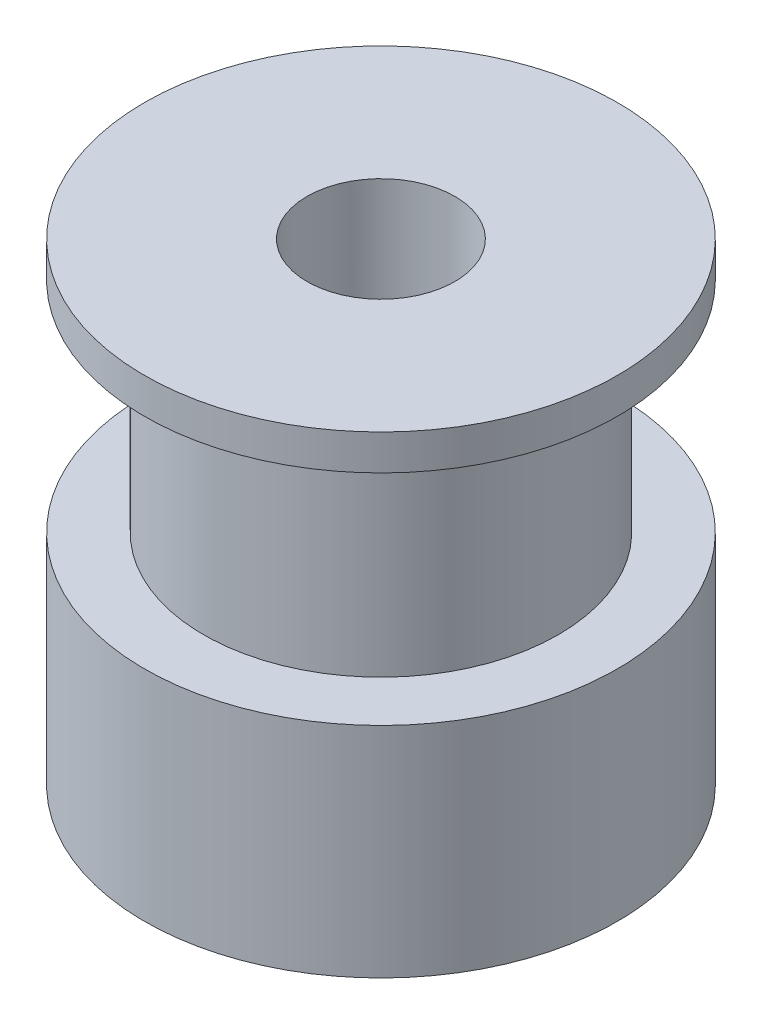
ISO-10303-21;
HEADER;
FILE_DESCRIPTION(('STEP AP214'),'2;1');
FILE_NAME('part.step','',(''),(''),'','','');
FILE_SCHEMA(('AUTOMOTIVE_DESIGN { 1 0 10303 214 1 1 1 1 }'));
ENDSEC;
DATA;
#1=APPLICATION_CONTEXT('core data for automotive mechanical design processes');
#2=APPLICATION_PROTOCOL_DEFINITION('international standard','automotive_design',2000,#1);
#3=PRODUCT_CONTEXT('',#1,'mechanical');
#4=PRODUCT('Part','Part','',(#3));
#5=PRODUCT_RELATED_PRODUCT_CATEGORY('part','',(#4));
#6=PRODUCT_DEFINITION_FORMATION('','',#4);
#7=PRODUCT_DEFINITION_CONTEXT('part definition',#1,'design');
#8=PRODUCT_DEFINITION('design','',#6,#7);
#9=PRODUCT_DEFINITION_SHAPE('','',#8);
#10=(LENGTH_UNIT() NAMED_UNIT(*) SI_UNIT(.MILLI.,.METRE.));
#11=(NAMED_UNIT(*) PLANE_ANGLE_UNIT() SI_UNIT($,.RADIAN.));
#12=(NAMED_UNIT(*) SI_UNIT($,.STERADIAN.) SOLID_ANGLE_UNIT());
#13=UNCERTAINTY_MEASURE_WITH_UNIT(LENGTH_MEASURE(1.E-05),#10,'distance_accuracy_value','');
#14=(GEOMETRIC_REPRESENTATION_CONTEXT(3) GLOBAL_UNCERTAINTY_ASSIGNED_CONTEXT((#13)) GLOBAL_UNIT_ASSIGNED_CONTEXT((#10,
#11,#12)) REPRESENTATION_CONTEXT('',''));
#15=CARTESIAN_POINT('',(0.,0.,0.));
#16=DIRECTION('',(0.,0.,1.));
#17=DIRECTION('',(1.,0.,0.));
#18=AXIS2_PLACEMENT_3D('',#15,#16,#17);
#19=CARTESIAN_POINT('',(0.,-11.,0.));
#20=DIRECTION('',(0.,-1.,0.));
#21=DIRECTION('',(1.,0.,0.));
#22=AXIS2_PLACEMENT_3D('',#19,#20,#21);
#23=PLANE('',#22);
#24=CARTESIAN_POINT('',(0.,-11.,0.));
#25=DIRECTION('',(0.,-1.,0.));
#26=DIRECTION('',(1.,0.,0.));
#27=AXIS2_PLACEMENT_3D('',#24,#25,#26);
#28=CIRCLE('',#27,2.5);
#29=CARTESIAN_POINT('',(2.5,-11.,0.));
#30=VERTEX_POINT('',#29);
#31=EDGE_CURVE('E72',#30,#30,#28,.F.);
#32=ORIENTED_EDGE('',*,*,#31,.T.);
#33=EDGE_LOOP('',(#32));
#34=FACE_BOUND('',#33,.T.);
#35=CARTESIAN_POINT('',(0.,-10.9999999999999,0.));
#36=DIRECTION('',(0.,1.,0.));
#37=DIRECTION('',(-1.,0.,0.));
#38=AXIS2_PLACEMENT_3D('',#35,#36,#37);
#39=CIRCLE('',#38,8.);
#40=CARTESIAN_POINT('',(-8.,-10.9999999999999,0.));
#41=VERTEX_POINT('',#40);
#42=EDGE_CURVE('E11',#41,#41,#39,.T.);
#43=ORIENTED_EDGE('',*,*,#42,.F.);
#44=EDGE_LOOP('',(#43));
#45=FACE_BOUND('',#44,.T.);
#46=ADVANCED_FACE('F39',(#34,#45),#23,.T.);
#47=CARTESIAN_POINT('',(0.,1004.77636363636,0.));
#48=DIRECTION('',(0.,1.,0.));
#49=DIRECTION('',(-1.,0.,0.));
#50=AXIS2_PLACEMENT_3D('',#47,#48,#49);
#51=CYLINDRICAL_SURFACE('',#50,8.);
#52=CARTESIAN_POINT('',(-7.74596669241484,-7.30000000000005,-1.99999999999997));
#53=CARTESIAN_POINT('',(-7.74596880070288,-7.18955939925879,-1.99999686287443));
#54=CARTESIAN_POINT('',(-7.74835444811678,-7.07908408105723,-1.99082099639809));
#55=CARTESIAN_POINT('',(-7.75761489594052,-6.86130593746124,-1.95441850037101));
#56=CARTESIAN_POINT('',(-7.76449230897305,-6.7540049964255,-1.92718136539366));
#57=CARTESIAN_POINT('',(-7.78190979676921,-6.5457571694503,-1.85559295970561));
#58=CARTESIAN_POINT('',(-7.79244514152367,-6.44480227569148,-1.81126378228357));
#59=CARTESIAN_POINT('',(-7.81598553623007,-6.25175131796814,-1.70681691300908));
#60=CARTESIAN_POINT('',(-7.82899069102792,-6.15965563033588,-1.64669855084852));
#61=CARTESIAN_POINT('',(-7.856325730845,-5.98491068379028,-1.51096674184948));
#62=CARTESIAN_POINT('',(-7.87067678098427,-5.90248511972001,-1.43506951016321));
#63=CARTESIAN_POINT('',(-7.89890300412235,-5.75139088451178,-1.2705456512805));
#64=CARTESIAN_POINT('',(-7.91277813253111,-5.68272349950265,-1.18191783534422));
#65=CARTESIAN_POINT('',(-7.93872332416466,-5.56017962589503,-0.992916160863138));
#66=CARTESIAN_POINT('',(-7.95076549920474,-5.50652288947088,-0.89239566095607));
#67=CARTESIAN_POINT('',(-7.97144649540787,-5.41695228467758,-0.683410547434183));
#68=CARTESIAN_POINT('',(-7.98008581867475,-5.38103579846764,-0.574947108633526));
#69=CARTESIAN_POINT('',(-7.99283807078544,-5.32868173233718,-0.355487007003302));
#70=CARTESIAN_POINT('',(-7.99703915075451,-5.31186428453878,-0.244586175639154));
#71=CARTESIAN_POINT('',(-8.00074875285838,-5.2969932965796,-0.0214630554101889));
#72=CARTESIAN_POINT('',(-8.00025796877363,-5.29893698223237,0.0907590356304813));
#73=CARTESIAN_POINT('',(-7.99470475962827,-5.32125988020016,0.310704494344801));
#74=CARTESIAN_POINT('',(-7.98974401872699,-5.34122906004313,0.41847243120216));
#75=CARTESIAN_POINT('',(-7.97592669219883,-5.39837701603885,0.629076494827399));
#76=CARTESIAN_POINT('',(-7.96706989918752,-5.43555670830197,0.731912358740902));
#77=CARTESIAN_POINT('',(-7.94630007760716,-5.5264020565497,0.930813407003639));
#78=CARTESIAN_POINT('',(-7.93436015756042,-5.58021363572944,1.02680901953303));
#79=CARTESIAN_POINT('',(-7.90871923047719,-5.70268454329305,1.208551244681));
#80=CARTESIAN_POINT('',(-7.89501791721991,-5.77134645484854,1.29429607017104));
#81=CARTESIAN_POINT('',(-7.86690971015616,-5.92376699358595,1.45554807016994));
#82=CARTESIAN_POINT('',(-7.85249375620733,-6.00788391387827,1.53071535815042));
#83=CARTESIAN_POINT('',(-7.82492034813364,-6.18767997883225,1.66595275192606));
#84=CARTESIAN_POINT('',(-7.81176295284776,-6.28335966359285,1.72602215209206));
#85=CARTESIAN_POINT('',(-7.78816397465318,-6.48423202731922,1.82957625804522));
#86=CARTESIAN_POINT('',(-7.77773586980576,-6.5894685842506,1.87297913394101));
#87=CARTESIAN_POINT('',(-7.76094912111965,-6.80606837446121,1.94137124127271));
#88=CARTESIAN_POINT('',(-7.75458960648174,-6.91743029118656,1.96636441310585));
#89=CARTESIAN_POINT('',(-7.74684284831312,-7.13996760121854,1.99666371093217));
#90=CARTESIAN_POINT('',(-7.74532871274918,-7.25107023466375,2.00247237913573));
#91=CARTESIAN_POINT('',(-7.74709874784831,-7.47265754926257,1.99561359241246));
#92=CARTESIAN_POINT('',(-7.75038247681012,-7.58314228636104,1.98294783827907));
#93=CARTESIAN_POINT('',(-7.76125665563648,-7.79849141196381,1.93994037115016));
#94=CARTESIAN_POINT('',(-7.76877576187499,-7.90341818125672,1.90989125462542));
#95=CARTESIAN_POINT('',(-7.78720574616769,-8.10674516628139,1.83329446533652));
#96=CARTESIAN_POINT('',(-7.7981170259889,-8.20514460724432,1.78674483817006));
#97=CARTESIAN_POINT('',(-7.82236909674609,-8.39475302229393,1.67741653434927));
#98=CARTESIAN_POINT('',(-7.83575334885313,-8.48578307203453,1.61433740306853));
#99=CARTESIAN_POINT('',(-7.86333666457372,-8.65615069024113,1.47412058586894));
#100=CARTESIAN_POINT('',(-7.87753586182776,-8.73548633332011,1.39698058961091));
#101=CARTESIAN_POINT('',(-7.90557922425284,-8.88224883405681,1.22852544196948));
#102=CARTESIAN_POINT('',(-7.91940561649468,-8.9493280500391,1.13690390506321));
#103=CARTESIAN_POINT('',(-7.94477773290987,-9.06714869356104,0.943405365389378));
#104=CARTESIAN_POINT('',(-7.95632357603168,-9.11789097328661,0.841528897915209));
#105=CARTESIAN_POINT('',(-7.9757609259065,-9.20115682762239,0.631116403462208));
#106=CARTESIAN_POINT('',(-7.98367864017924,-9.2338114275033,0.522634762055791));
#107=CARTESIAN_POINT('',(-7.99508234716633,-9.28036826768678,0.301499520637641));
#108=CARTESIAN_POINT('',(-7.99856919514738,-9.29427412699128,0.188846730082509));
#109=CARTESIAN_POINT('',(-8.00068338817611,-9.30273517915112,-0.0341670528866179));
#110=CARTESIAN_POINT('',(-7.99943957759977,-9.29780341819086,-0.144507653932015));
#111=CARTESIAN_POINT('',(-7.99251792914887,-9.26990434541135,-0.362734992829473));
#112=CARTESIAN_POINT('',(-7.98684022314338,-9.24693756997371,-0.470621803561829));
#113=CARTESIAN_POINT('',(-7.97170865707778,-9.18389556045832,-0.680342071289521));
#114=CARTESIAN_POINT('',(-7.96227529004785,-9.14391309337129,-0.782204989161699));
#115=CARTESIAN_POINT('',(-7.94062577827316,-9.0480588419609,-0.977834106083221));
#116=CARTESIAN_POINT('',(-7.92840928277515,-8.99218505465908,-1.07159928253124));
#117=CARTESIAN_POINT('',(-7.90214499360574,-8.86456953200778,-1.25080385684658));
#118=CARTESIAN_POINT('',(-7.88806033883329,-8.79247971419239,-1.33598997659664));
#119=CARTESIAN_POINT('',(-7.8598129811438,-8.63515429604535,-1.49323004054698));
#120=CARTESIAN_POINT('',(-7.84565025934605,-8.54991536777772,-1.56528065015315));
#121=CARTESIAN_POINT('',(-7.81854951691005,-8.36679717162113,-1.69552405294364));
#122=CARTESIAN_POINT('',(-7.80563927346578,-8.26871175326954,-1.75343323883273));
#123=CARTESIAN_POINT('',(-7.78287910989656,-8.06388902025041,-1.85185379317091));
#124=CARTESIAN_POINT('',(-7.77302696466428,-7.95715806781236,-1.89237781950428));
#125=CARTESIAN_POINT('',(-7.75903817501475,-7.75884597632973,-1.94884505714198));
#126=CARTESIAN_POINT('',(-7.75417326006998,-7.66821367122777,-1.96798634119373));
#127=CARTESIAN_POINT('',(-7.74763677165241,-7.48506226200467,-1.99356458514351));
#128=CARTESIAN_POINT('',(-7.74596492578216,-7.39254331951124,-2.00000262874347));
#129=CARTESIAN_POINT('',(-7.74596669241484,-7.30000000000005,-1.99999999999997));
#130=B_SPLINE_CURVE_WITH_KNOTS('',3,(#52,#53,#54,#55,#56,#57,#58,#59,#60,#61,#62,#63,#64,#65,
#66,#67,#68,#69,#70,#71,#72,#73,#74,#75,#76,#77,#78,#79,#80,#81,#82,#83,#84,#85,#86,#87,#88,#89,
#90,#91,#92,#93,#94,#95,#96,#97,#98,#99,#100,#101,#102,#103,#104,#105,#106,#107,#108,#109,#110,
#111,#112,#113,#114,#115,#116,#117,#118,#119,#120,#121,#122,#123,#124,#125,#126,#127,#128,#129),
.UNSPECIFIED.,.T.,.F.,(4,2,2,2,2,2,2,2,2,2,2,2,2,2,2,2,2,2,2,2,2,2,2,2,2,2,2,2,2,2,2,2,2,2,2,2,
2,2,4),(0.,0.33098195338891,0.662156593142933,0.992904581732815,1.32366661404383,
1.66099163354381,1.99834817183893,2.34041197118336,2.68242527877674,3.01751000796277,
3.35254518932816,3.68014610151158,4.00776445379829,4.33834299403556,4.66897908375131,
5.00856373257529,5.34816424959842,5.68941145606722,6.03058560103638,6.36274859809374,
6.69488101747042,7.02157924007366,7.34831617137134,7.68146276687326,8.01466415108036,
8.35620264772255,8.69772332575643,9.03673658245543,9.3756843912723,9.70546756901965,
10.0352409390158,10.3632390124777,10.6912784459046,11.0271767726566,11.3631602525241,
11.7054118182895,12.0474137709606,12.3247826174462,12.6021278008238),.UNSPECIFIED.);
#131=CARTESIAN_POINT('',(-7.74596669241484,-7.30000000000005,-1.99999999999997));
#132=VERTEX_POINT('',#131);
#133=EDGE_CURVE('E61',#132,#132,#130,.T.);
#134=ORIENTED_EDGE('',*,*,#133,.T.);
#135=EDGE_LOOP('',(#134));
#136=FACE_BOUND('',#135,.T.);
#137=CARTESIAN_POINT('',(2.,-7.30000000000005,-7.74596669241483));
#138=CARTESIAN_POINT('',(1.99999686287446,-7.18955939925879,-7.74596880070288));
#139=CARTESIAN_POINT('',(1.99082099639812,-7.07908408105723,-7.74835444811678));
#140=CARTESIAN_POINT('',(1.95441850037104,-6.86130593746124,-7.75761489594051));
#141=CARTESIAN_POINT('',(1.92718136539368,-6.7540049964255,-7.76449230897304));
#142=CARTESIAN_POINT('',(1.85559295970563,-6.5457571694503,-7.7819097967692));
#143=CARTESIAN_POINT('',(1.81126378228359,-6.44480227569148,-7.79244514152366));
#144=CARTESIAN_POINT('',(1.70681691300911,-6.25175131796814,-7.81598553623007));
#145=CARTESIAN_POINT('',(1.64669855084855,-6.15965563033587,-7.82899069102791));
#146=CARTESIAN_POINT('',(1.51096674184951,-5.98491068379028,-7.856325730845));
#147=CARTESIAN_POINT('',(1.43506951016324,-5.90248511972001,-7.87067678098427));
#148=CARTESIAN_POINT('',(1.27054565128053,-5.75139088451178,-7.89890300412235));
#149=CARTESIAN_POINT('',(1.18191783534425,-5.68272349950265,-7.9127781325311));
#150=CARTESIAN_POINT('',(0.992916160863165,-5.56017962589503,-7.93872332416466));
#151=CARTESIAN_POINT('',(0.892395660956098,-5.50652288947088,-7.95076549920474));
#152=CARTESIAN_POINT('',(0.683410547434211,-5.41695228467758,-7.97144649540787));
#153=CARTESIAN_POINT('',(0.574947108633553,-5.38103579846764,-7.98008581867475));
#154=CARTESIAN_POINT('',(0.35548700700333,-5.32868173233718,-7.99283807078544));
#155=CARTESIAN_POINT('',(0.244586175639181,-5.31186428453878,-7.99703915075451));
#156=CARTESIAN_POINT('',(0.0214630554102163,-5.2969932965796,-8.00074875285838));
#157=CARTESIAN_POINT('',(-0.0907590356304541,-5.29893698223237,-8.00025796877363));
#158=CARTESIAN_POINT('',(-0.310704494344774,-5.32125988020016,-7.99470475962828));
#159=CARTESIAN_POINT('',(-0.418472431202133,-5.34122906004313,-7.98974401872699));
#160=CARTESIAN_POINT('',(-0.629076494827372,-5.39837701603885,-7.97592669219883));
#161=CARTESIAN_POINT('',(-0.731912358740875,-5.43555670830198,-7.96706989918752));
#162=CARTESIAN_POINT('',(-0.930813407003612,-5.5264020565497,-7.94630007760716));
#163=CARTESIAN_POINT('',(-1.02680901953301,-5.58021363572945,-7.93436015756043));
#164=CARTESIAN_POINT('',(-1.20855124468098,-5.70268454329305,-7.90871923047719));
#165=CARTESIAN_POINT('',(-1.29429607017101,-5.77134645484854,-7.89501791721992));
#166=CARTESIAN_POINT('',(-1.45554807016991,-5.92376699358595,-7.86690971015616));
#167=CARTESIAN_POINT('',(-1.5307153581504,-6.00788391387827,-7.85249375620734));
#168=CARTESIAN_POINT('',(-1.66595275192604,-6.18767997883225,-7.82492034813365));
#169=CARTESIAN_POINT('',(-1.72602215209203,-6.28335966359285,-7.81176295284776));
#170=CARTESIAN_POINT('',(-1.82957625804519,-6.48423202731922,-7.78816397465318));
#171=CARTESIAN_POINT('',(-1.87297913394098,-6.5894685842506,-7.77773586980576));
#172=CARTESIAN_POINT('',(-1.94137124127268,-6.80606837446121,-7.76094912111965));
#173=CARTESIAN_POINT('',(-1.96636441310582,-6.91743029118656,-7.75458960648175));
#174=CARTESIAN_POINT('',(-1.99666371093214,-7.13996760121854,-7.74684284831312));
#175=CARTESIAN_POINT('',(-2.0024723791357,-7.25107023466375,-7.74532871274918));
#176=CARTESIAN_POINT('',(-1.99561359241244,-7.47265754926257,-7.74709874784831));
#177=CARTESIAN_POINT('',(-1.98294783827904,-7.58314228636104,-7.75038247681013));
#178=CARTESIAN_POINT('',(-1.93994037115013,-7.79849141196381,-7.76125665563648));
#179=CARTESIAN_POINT('',(-1.9098912546254,-7.90341818125672,-7.768775761875));
#180=CARTESIAN_POINT('',(-1.8332944653365,-8.10674516628139,-7.7872057461677));
#181=CARTESIAN_POINT('',(-1.78674483817004,-8.20514460724432,-7.7981170259889));
#182=CARTESIAN_POINT('',(-1.67741653434924,-8.39475302229393,-7.8223690967461));
#183=CARTESIAN_POINT('',(-1.6143374030685,-8.48578307203453,-7.83575334885313));
#184=CARTESIAN_POINT('',(-1.47412058586891,-8.65615069024113,-7.86333666457373));
#185=CARTESIAN_POINT('',(-1.39698058961088,-8.73548633332011,-7.87753586182776));
#186=CARTESIAN_POINT('',(-1.22852544196945,-8.88224883405681,-7.90557922425285));
#187=CARTESIAN_POINT('',(-1.13690390506319,-8.9493280500391,-7.91940561649468));
#188=CARTESIAN_POINT('',(-0.94340536538935,-9.06714869356104,-7.94477773290987));
#189=CARTESIAN_POINT('',(-0.841528897915181,-9.11789097328661,-7.95632357603169));
#190=CARTESIAN_POINT('',(-0.63111640346218,-9.20115682762239,-7.9757609259065));
#191=CARTESIAN_POINT('',(-0.522634762055763,-9.2338114275033,-7.98367864017925));
#192=CARTESIAN_POINT('',(-0.301499520637613,-9.28036826768678,-7.99508234716633));
#193=CARTESIAN_POINT('',(-0.188846730082481,-9.29427412699128,-7.99856919514738));
#194=CARTESIAN_POINT('',(0.0341670528866463,-9.30273517915112,-8.00068338817611));
#195=CARTESIAN_POINT('',(0.144507653932043,-9.29780341819086,-7.99943957759977));
#196=CARTESIAN_POINT('',(0.362734992829501,-9.26990434541135,-7.99251792914887));
#197=CARTESIAN_POINT('',(0.470621803561857,-9.24693756997371,-7.98684022314338));
#198=CARTESIAN_POINT('',(0.680342071289548,-9.18389556045832,-7.97170865707778));
#199=CARTESIAN_POINT('',(0.782204989161726,-9.14391309337129,-7.96227529004785));
#200=CARTESIAN_POINT('',(0.977834106083249,-9.0480588419609,-7.94062577827316));
#201=CARTESIAN_POINT('',(1.07159928253127,-8.99218505465908,-7.92840928277515));
#202=CARTESIAN_POINT('',(1.25080385684661,-8.86456953200778,-7.90214499360574));
#203=CARTESIAN_POINT('',(1.33598997659667,-8.79247971419239,-7.88806033883329));
#204=CARTESIAN_POINT('',(1.49323004054701,-8.63515429604535,-7.85981298114379));
#205=CARTESIAN_POINT('',(1.56528065015318,-8.54991536777772,-7.84565025934604));
#206=CARTESIAN_POINT('',(1.69552405294366,-8.36679717162113,-7.81854951691005));
#207=CARTESIAN_POINT('',(1.75343323883276,-8.26871175326954,-7.80563927346577));
#208=CARTESIAN_POINT('',(1.85185379317094,-8.06388902025041,-7.78287910989656));
#209=CARTESIAN_POINT('',(1.8923778195043,-7.95715806781236,-7.77302696466427));
#210=CARTESIAN_POINT('',(1.94884505714201,-7.75884597632973,-7.75903817501474));
#211=CARTESIAN_POINT('',(1.96798634119376,-7.66821367122777,-7.75417326006998));
#212=CARTESIAN_POINT('',(1.99356458514354,-7.48506226200467,-7.7476367716524));
#213=CARTESIAN_POINT('',(2.0000026287435,-7.39254331951124,-7.74596492578215));
#214=CARTESIAN_POINT('',(2.,-7.30000000000005,-7.74596669241483));
#215=B_SPLINE_CURVE_WITH_KNOTS('',3,(#137,#138,#139,#140,#141,#142,#143,#144,#145,#146,#147,
#148,#149,#150,#151,#152,#153,#154,#155,#156,#157,#158,#159,#160,#161,#162,#163,#164,#165,#166,
#167,#168,#169,#170,#171,#172,#173,#174,#175,#176,#177,#178,#179,#180,#181,#182,#183,#184,#185,
#186,#187,#188,#189,#190,#191,#192,#193,#194,#195,#196,#197,#198,#199,#200,#201,#202,#203,#204,
#205,#206,#207,#208,#209,#210,#211,#212,#213,#214),.UNSPECIFIED.,.T.,.F.,(4,2,2,2,2,2,2,2,2,2,2,
2,2,2,2,2,2,2,2,2,2,2,2,2,2,2,2,2,2,2,2,2,2,2,2,2,2,2,4),(0.,0.330981953388909,
0.662156593142933,0.992904581732816,1.32366661404383,1.66099163354381,1.99834817183893,
2.34041197118336,2.68242527877674,3.01751000796277,3.35254518932816,3.68014610151158,
4.00776445379829,4.33834299403556,4.66897908375131,5.00856373257529,5.34816424959841,
5.68941145606722,6.03058560103638,6.36274859809373,6.69488101747041,7.02157924007365,
7.34831617137134,7.68146276687326,8.01466415108036,8.35620264772255,8.69772332575643,
9.03673658245543,9.3756843912723,9.70546756901965,10.0352409390158,10.3632390124777,
10.6912784459046,11.0271767726566,11.3631602525241,11.7054118182895,12.0474137709606,
12.3247826174462,12.6021278008238),.UNSPECIFIED.);
#216=CARTESIAN_POINT('',(2.,-7.30000000000005,-7.74596669241483));
#217=VERTEX_POINT('',#216);
#218=EDGE_CURVE('E68',#217,#217,#215,.T.);
#219=ORIENTED_EDGE('',*,*,#218,.T.);
#220=EDGE_LOOP('',(#219));
#221=FACE_BOUND('',#220,.T.);
#222=ORIENTED_EDGE('',*,*,#42,.T.);
#223=EDGE_LOOP('',(#222));
#224=FACE_BOUND('',#223,.T.);
#225=CARTESIAN_POINT('',(0.,-3.60000000000005,0.));
#226=DIRECTION('',(0.,1.,0.));
#227=DIRECTION('',(-1.,0.,0.));
#228=AXIS2_PLACEMENT_3D('',#225,#226,#227);
#229=CIRCLE('',#228,8.);
#230=CARTESIAN_POINT('',(-8.,-3.60000000000005,0.));
#231=VERTEX_POINT('',#230);
#232=EDGE_CURVE('E47',#231,#231,#229,.T.);
#233=ORIENTED_EDGE('',*,*,#232,.F.);
#234=EDGE_LOOP('',(#233));
#235=FACE_BOUND('',#234,.T.);
#236=ADVANCED_FACE('F117',(#136,#221,#224,#235),#51,.T.);
#237=CARTESIAN_POINT('',(-6.,-3.6,0.));
#238=DIRECTION('',(0.,1.,0.));
#239=DIRECTION('',(-1.,0.,0.));
#240=AXIS2_PLACEMENT_3D('',#237,#238,#239);
#241=PLANE('',#240);
#242=ORIENTED_EDGE('',*,*,#232,.T.);
#243=EDGE_LOOP('',(#242));
#244=FACE_BOUND('',#243,.T.);
#245=CARTESIAN_POINT('',(0.,-3.60000000000005,0.));
#246=DIRECTION('',(0.,1.,0.));
#247=DIRECTION('',(-1.,0.,0.));
#248=AXIS2_PLACEMENT_3D('',#245,#246,#247);
#249=CIRCLE('',#248,6.);
#250=CARTESIAN_POINT('',(-6.,-3.60000000000005,0.));
#251=VERTEX_POINT('',#250);
#252=EDGE_CURVE('E133',#251,#251,#249,.T.);
#253=ORIENTED_EDGE('',*,*,#252,.F.);
#254=EDGE_LOOP('',(#253));
#255=FACE_BOUND('',#254,.T.);
#256=ADVANCED_FACE('F122',(#244,#255),#241,.T.);
#257=CARTESIAN_POINT('',(0.,1004.77636363636,0.));
#258=DIRECTION('',(0.,1.,0.));
#259=DIRECTION('',(-1.,0.,0.));
#260=AXIS2_PLACEMENT_3D('',#257,#258,#259);
#261=CYLINDRICAL_SURFACE('',#260,6.);
#262=ORIENTED_EDGE('',*,*,#252,.T.);
#263=EDGE_LOOP('',(#262));
#264=FACE_BOUND('',#263,.T.);
#265=CARTESIAN_POINT('',(0.,3.80000000000003,0.));
#266=DIRECTION('',(0.,1.,0.));
#267=DIRECTION('',(-1.,0.,0.));
#268=AXIS2_PLACEMENT_3D('',#265,#266,#267);
#269=CIRCLE('',#268,6.);
#270=CARTESIAN_POINT('',(-6.,3.80000000000003,0.));
#271=VERTEX_POINT('',#270);
#272=EDGE_CURVE('E136',#271,#271,#269,.T.);
#273=ORIENTED_EDGE('',*,*,#272,.F.);
#274=EDGE_LOOP('',(#273));
#275=FACE_BOUND('',#274,.T.);
#276=ADVANCED_FACE('F168',(#264,#275),#261,.T.);
#277=CARTESIAN_POINT('',(-6.,3.8,0.));
#278=DIRECTION('',(0.,-1.,0.));
#279=DIRECTION('',(1.,0.,0.));
#280=AXIS2_PLACEMENT_3D('',#277,#278,#279);
#281=PLANE('',#280);
#282=ORIENTED_EDGE('',*,*,#272,.T.);
#283=EDGE_LOOP('',(#282));
#284=FACE_BOUND('',#283,.T.);
#285=CARTESIAN_POINT('',(0.,3.80000000000003,0.));
#286=DIRECTION('',(0.,1.,0.));
#287=DIRECTION('',(-1.,0.,0.));
#288=AXIS2_PLACEMENT_3D('',#285,#286,#287);
#289=CIRCLE('',#288,8.);
#290=CARTESIAN_POINT('',(-8.,3.80000000000003,0.));
#291=VERTEX_POINT('',#290);
#292=EDGE_CURVE('E142',#291,#291,#289,.T.);
#293=ORIENTED_EDGE('',*,*,#292,.F.);
#294=EDGE_LOOP('',(#293));
#295=FACE_BOUND('',#294,.T.);
#296=ADVANCED_FACE('F162',(#284,#295),#281,.T.);
#297=CARTESIAN_POINT('',(0.,1004.77636363636,0.));
#298=DIRECTION('',(0.,1.,0.));
#299=DIRECTION('',(-1.,0.,0.));
#300=AXIS2_PLACEMENT_3D('',#297,#298,#299);
#301=CYLINDRICAL_SURFACE('',#300,8.);
#302=ORIENTED_EDGE('',*,*,#292,.T.);
#303=EDGE_LOOP('',(#302));
#304=FACE_BOUND('',#303,.T.);
#305=CARTESIAN_POINT('',(0.,5.,0.));
#306=DIRECTION('',(0.,1.,0.));
#307=DIRECTION('',(-1.,0.,0.));
#308=AXIS2_PLACEMENT_3D('',#305,#306,#307);
#309=CIRCLE('',#308,8.);
#310=CARTESIAN_POINT('',(-8.,5.,0.));
#311=VERTEX_POINT('',#310);
#312=EDGE_CURVE('E146',#311,#311,#309,.T.);
#313=ORIENTED_EDGE('',*,*,#312,.F.);
#314=EDGE_LOOP('',(#313));
#315=FACE_BOUND('',#314,.T.);
#316=ADVANCED_FACE('F157',(#304,#315),#301,.T.);
#317=CARTESIAN_POINT('',(0.,5.,0.));
#318=DIRECTION('',(0.,1.,0.));
#319=DIRECTION('',(-1.,0.,0.));
#320=AXIS2_PLACEMENT_3D('',#317,#318,#319);
#321=PLANE('',#320);
#322=CARTESIAN_POINT('',(0.,5.,0.));
#323=DIRECTION('',(0.,1.,0.));
#324=DIRECTION('',(-1.,0.,0.));
#325=AXIS2_PLACEMENT_3D('',#322,#323,#324);
#326=CIRCLE('',#325,2.5);
#327=CARTESIAN_POINT('',(-2.5,5.,0.));
#328=VERTEX_POINT('',#327);
#329=EDGE_CURVE('E77',#328,#328,#326,.T.);
#330=ORIENTED_EDGE('',*,*,#329,.F.);
#331=EDGE_LOOP('',(#330));
#332=FACE_BOUND('',#331,.T.);
#333=ORIENTED_EDGE('',*,*,#312,.T.);
#334=EDGE_LOOP('',(#333));
#335=FACE_BOUND('',#334,.T.);
#336=ADVANCED_FACE('F154',(#332,#335),#321,.T.);
#337=CARTESIAN_POINT('',(0.,-11.0009999999999,0.));
#338=DIRECTION('',(0.,1.,0.));
#339=DIRECTION('',(-1.,0.,0.));
#340=AXIS2_PLACEMENT_3D('',#337,#338,#339);
#341=CYLINDRICAL_SURFACE('',#340,2.5);
#342=CARTESIAN_POINT('',(2.,-7.30000000000005,-1.5));
#343=CARTESIAN_POINT('',(1.9999899563842,-7.22491898261149,-1.5000227575991));
#344=CARTESIAN_POINT('',(1.99572243014959,-7.14972107390643,-1.50575588676017));
#345=CARTESIAN_POINT('',(1.97904350434638,-7.00168547057043,-1.52759797098302));
#346=CARTESIAN_POINT('',(1.96660415938923,-6.92885677818791,-1.54374252679463));
#347=CARTESIAN_POINT('',(1.9288828901246,-6.7623945804915,-1.59078313764401));
#348=CARTESIAN_POINT('',(1.90063587852784,-6.6703574929005,-1.62485949442394));
#349=CARTESIAN_POINT('',(1.83286412912234,-6.49403185983876,-1.70094533012843));
#350=CARTESIAN_POINT('',(1.79330760683741,-6.40976605033291,-1.74297705283045));
#351=CARTESIAN_POINT('',(1.68777756612173,-6.21966034321953,-1.84624966659378));
#352=CARTESIAN_POINT('',(1.61742363711761,-6.11703342587276,-1.90894188114929));
#353=CARTESIAN_POINT('',(1.4586193506474,-5.92602316478783,-2.03287996747903));
#354=CARTESIAN_POINT('',(1.37018407682201,-5.83762805788615,-2.0941269976447));
#355=CARTESIAN_POINT('',(1.19476026278806,-5.69289508042257,-2.1979067439451));
#356=CARTESIAN_POINT('',(1.11093376146689,-5.63367371731597,-2.24174680788007));
#357=CARTESIAN_POINT('',(0.932444755507563,-5.52763404003375,-2.32165152523267));
#358=CARTESIAN_POINT('',(0.837799422094951,-5.48079645179917,-2.35772824500368));
#359=CARTESIAN_POINT('',(0.655317082222548,-5.40828703941939,-2.41415644696378));
#360=CARTESIAN_POINT('',(0.568853585755694,-5.38041743542393,-2.43610736091393));
#361=CARTESIAN_POINT('',(0.39118805292199,-5.33650130474605,-2.47085912284979));
#362=CARTESIAN_POINT('',(0.299988637312622,-5.32044831209,-2.48366497483986));
#363=CARTESIAN_POINT('',(0.115048335136527,-5.30114190670991,-2.49907968883617));
#364=CARTESIAN_POINT('',(0.0212997713727001,-5.29793280731141,-2.50165324772141));
#365=CARTESIAN_POINT('',(-0.165416366428142,-5.30466423487223,-2.49626936144757));
#366=CARTESIAN_POINT('',(-0.258383904122234,-5.31460537036859,-2.48831142893578));
#367=CARTESIAN_POINT('',(-0.435683568436099,-5.34606798631309,-2.4632836571348));
#368=CARTESIAN_POINT('',(-0.5202101889175,-5.36692881695612,-2.44673404857181));
#369=CARTESIAN_POINT('',(-0.684171862172427,-5.41869523425228,-2.40604493660584));
#370=CARTESIAN_POINT('',(-0.763605624129771,-5.44960335549761,-2.38190351809567));
#371=CARTESIAN_POINT('',(-0.923527318234434,-5.52360069858856,-2.32486221996811));
#372=CARTESIAN_POINT('',(-1.00337969293305,-5.56757651601475,-2.29134265660255));
#373=CARTESIAN_POINT('',(-1.15470891362336,-5.66453785959175,-2.21894043646479));
#374=CARTESIAN_POINT('',(-1.22618103296473,-5.71752842936313,-2.18005477975511));
#375=CARTESIAN_POINT('',(-1.37426521356107,-5.84306186879889,-2.09053510980241));
#376=CARTESIAN_POINT('',(-1.44890108738507,-5.91738361420491,-2.03913144290366));
#377=CARTESIAN_POINT('',(-1.58538384993671,-6.07625590365079,-1.9349237792571));
#378=CARTESIAN_POINT('',(-1.6472149443604,-6.16081887867432,-1.88211814269102));
#379=CARTESIAN_POINT('',(-1.75228528490804,-6.33122019581797,-1.78441317626436));
#380=CARTESIAN_POINT('',(-1.79674173995946,-6.41615094051375,-1.73924224553799));
#381=CARTESIAN_POINT('',(-1.87389106987978,-6.59436646633457,-1.65582105773209));
#382=CARTESIAN_POINT('',(-1.90660965872838,-6.68763242033769,-1.61755576516689));
#383=CARTESIAN_POINT('',(-1.95062199735974,-6.8527916040278,-1.56393805143324));
#384=CARTESIAN_POINT('',(-1.96540293714784,-6.92261283089795,-1.54515601955456));
#385=CARTESIAN_POINT('',(-1.98746978122375,-7.0651802059542,-1.51667304681101));
#386=CARTESIAN_POINT('',(-1.99477239579985,-7.13791945391071,-1.50695186390373));
#387=CARTESIAN_POINT('',(-2.0012999442642,-7.28486337792742,-1.49827790293909));
#388=CARTESIAN_POINT('',(-2.00047806264257,-7.35907408505749,-1.49938753445573));
#389=CARTESIAN_POINT('',(-1.99072610261057,-7.50604732503746,-1.51230456185753));
#390=CARTESIAN_POINT('',(-1.98178458332098,-7.57880766638751,-1.52412705251965));
#391=CARTESIAN_POINT('',(-1.95331430449203,-7.73906320266187,-1.56051508430773));
#392=CARTESIAN_POINT('',(-1.9316709289088,-7.82559826813088,-1.58755721486228));
#393=CARTESIAN_POINT('',(-1.87841388450525,-7.99229086608552,-1.65022809339808));
#394=CARTESIAN_POINT('',(-1.84677049067316,-8.07242848090315,-1.6858823654909));
#395=CARTESIAN_POINT('',(-1.75807608919816,-8.26152892934934,-1.77903249993889));
#396=CARTESIAN_POINT('',(-1.69602510944931,-8.36689533432521,-1.83905564347524));
#397=CARTESIAN_POINT('',(-1.55438039564658,-8.56438414924206,-1.96026853157683));
#398=CARTESIAN_POINT('',(-1.47476601547362,-8.65649075968351,-2.0214595710443));
#399=CARTESIAN_POINT('',(-1.29702304107541,-8.82746280734508,-2.13993299259158));
#400=CARTESIAN_POINT('',(-1.19864860522963,-8.90612262911312,-2.1971478825966));
#401=CARTESIAN_POINT('',(-0.984970277741321,-9.04526652744424,-2.30083046289374));
#402=CARTESIAN_POINT('',(-0.869723203455193,-9.10580960567068,-2.34733292440641));
#403=CARTESIAN_POINT('',(-0.664531994140975,-9.18849058746693,-2.41163161860483));
#404=CARTESIAN_POINT('',(-0.578408265123337,-9.21671737697415,-2.43384921549886));
#405=CARTESIAN_POINT('',(-0.401365381235635,-9.26143213496402,-2.46921550391513));
#406=CARTESIAN_POINT('',(-0.310449944179062,-9.27792906454066,-2.48237111815073));
#407=CARTESIAN_POINT('',(-0.125961358052307,-9.29819282410475,-2.49854699723994));
#408=CARTESIAN_POINT('',(-0.0323797561454526,-9.30191320505836,-2.50153028039159));
#409=CARTESIAN_POINT('',(0.154129494971551,-9.29623349073483,-2.4969871999336));
#410=CARTESIAN_POINT('',(0.247057097671187,-9.28683247159175,-2.48946009629711));
#411=CARTESIAN_POINT('',(0.424484983307844,-9.25639645290883,-2.46524008405095));
#412=CARTESIAN_POINT('',(0.509170159101614,-9.2360106685972,-2.44905900306101));
#413=CARTESIAN_POINT('',(0.673520542356744,-9.18514657868658,-2.4090520196301));
#414=CARTESIAN_POINT('',(0.753184443303526,-9.15466565917403,-2.3852241372675));
#415=CARTESIAN_POINT('',(0.91338359185187,-9.08162545560749,-2.32886203207213));
#416=CARTESIAN_POINT('',(0.993310088153975,-9.03820615788905,-2.29572397002092));
#417=CARTESIAN_POINT('',(1.14486396126306,-8.94235766290542,-2.22403396009593));
#418=CARTESIAN_POINT('',(1.21648689776308,-8.88992368193156,-2.18547913977515));
#419=CARTESIAN_POINT('',(1.36488223995398,-8.76570378699636,-2.0966685242987));
#420=CARTESIAN_POINT('',(1.43970803793641,-8.69215358668463,-2.04563299169992));
#421=CARTESIAN_POINT('',(1.57669353079991,-8.53488307447665,-1.94201312920059));
#422=CARTESIAN_POINT('',(1.63883728583053,-8.45115017239471,-1.88942694411833));
#423=CARTESIAN_POINT('',(1.7455126136634,-8.28104245547046,-1.79109125321811));
#424=CARTESIAN_POINT('',(1.79106140064659,-8.19542747878398,-1.74513263017547));
#425=CARTESIAN_POINT('',(1.87016304685231,-8.01560811174868,-1.66007449903139));
#426=CARTESIAN_POINT('',(1.90373836359645,-7.92142022196231,-1.6209622208173));
#427=CARTESIAN_POINT('',(1.94914139922438,-7.75386067324738,-1.56580101941138));
#428=CARTESIAN_POINT('',(1.96446470848963,-7.68258045559285,-1.54635220628733));
#429=CARTESIAN_POINT('',(1.98726282623962,-7.53697572902918,-1.51695472225641));
#430=CARTESIAN_POINT('',(1.99476751139893,-7.4626639447221,-1.50696990066825));
#431=CARTESIAN_POINT('',(1.99935742227831,-7.35867478565772,-1.50085460132402));
#432=CARTESIAN_POINT('',(2.00000392566845,-7.32934632175658,-1.49999110491774));
#433=CARTESIAN_POINT('',(2.,-7.30000000000005,-1.5));
#434=B_SPLINE_CURVE_WITH_KNOTS('',3,(#342,#343,#344,#345,#346,#347,#348,#349,#350,#351,#352,
#353,#354,#355,#356,#357,#358,#359,#360,#361,#362,#363,#364,#365,#366,#367,#368,#369,#370,#371,
#372,#373,#374,#375,#376,#377,#378,#379,#380,#381,#382,#383,#384,#385,#386,#387,#388,#389,#390,
#391,#392,#393,#394,#395,#396,#397,#398,#399,#400,#401,#402,#403,#404,#405,#406,#407,#408,#409,
#410,#411,#412,#413,#414,#415,#416,#417,#418,#419,#420,#421,#422,#423,#424,#425,#426,#427,#428,
#429,#430,#431,#432,#433),.UNSPECIFIED.,.T.,.F.,(4,2,2,2,2,2,2,2,2,2,2,2,2,2,2,2,2,2,2,2,2,2,2,
2,2,2,2,2,2,2,2,2,2,2,2,2,2,2,2,2,2,2,2,2,2,4),(0.,0.22514081881329,0.451055593895017,
0.755714384660881,1.06123795594964,1.47720804611674,1.8928325353688,2.22639303179097,
2.55943127851025,2.83862094435178,3.11765772560939,3.39765639927928,3.67766803055209,
3.94241917501297,4.20723715914625,4.49756510688428,4.78805602626153,5.13841226546405,
5.48919811771067,5.80619193384967,6.12248701337037,6.34307726284838,6.56317352160417,
6.78453876949455,7.00621641426759,7.28428560377195,7.56318925297414,7.96975811975667,
8.37680748728571,8.78961174948153,9.20105660259844,9.47985927613151,9.75844872724253,
10.0380499218877,10.3176708039936,10.5823344198312,10.8470666181456,11.1364335884202,
11.4259545900794,11.7747351905783,12.1239515037794,12.4449574092071,12.7653580273015,
12.9909138326702,13.2156045429056,13.3036035490356),.UNSPECIFIED.);
#435=CARTESIAN_POINT('',(-1.76776695296676,-8.23541434669368,-1.76776695296598));
#436=VERTEX_POINT('',#435);
#437=CARTESIAN_POINT('',(-1.76776695296895,-6.36458565330376,-1.76776695296395));
#438=VERTEX_POINT('',#437);
#439=EDGE_CURVE('E66',#436,#438,#434,.T.);
#440=ORIENTED_EDGE('',*,*,#439,.F.);
#441=CARTESIAN_POINT('',(-1.5,-7.30000000000005,-2.));
#442=CARTESIAN_POINT('',(-1.5000227575991,-7.22491898261149,-1.99998995638419));
#443=CARTESIAN_POINT('',(-1.50575588676017,-7.14972107390643,-1.99572243014958));
#444=CARTESIAN_POINT('',(-1.52759797098303,-7.00168547057043,-1.97904350434638));
#445=CARTESIAN_POINT('',(-1.54374252679464,-6.92885677818791,-1.96660415938922));
#446=CARTESIAN_POINT('',(-1.59078313764402,-6.7623945804915,-1.92888289012459));
#447=CARTESIAN_POINT('',(-1.62485949442395,-6.6703574929005,-1.90063587852783));
#448=CARTESIAN_POINT('',(-1.70094533012843,-6.49403185983876,-1.83286412912234));
#449=CARTESIAN_POINT('',(-1.74297705283046,-6.40976605033291,-1.7933076068374));
#450=CARTESIAN_POINT('',(-1.84624966659379,-6.21966034321953,-1.68777756612172));
#451=CARTESIAN_POINT('',(-1.9089418811493,-6.11703342587276,-1.6174236371176));
#452=CARTESIAN_POINT('',(-2.03287996747903,-5.92602316478783,-1.45861935064739));
#453=CARTESIAN_POINT('',(-2.09412699764471,-5.83762805788615,-1.370184076822));
#454=CARTESIAN_POINT('',(-2.19790674394511,-5.69289508042257,-1.19476026278806));
#455=CARTESIAN_POINT('',(-2.24174680788008,-5.63367371731597,-1.11093376146688));
#456=CARTESIAN_POINT('',(-2.32165152523268,-5.52763404003375,-0.932444755507555));
#457=CARTESIAN_POINT('',(-2.35772824500368,-5.48079645179917,-0.837799422094942));
#458=CARTESIAN_POINT('',(-2.41415644696378,-5.40828703941939,-0.655317082222539));
#459=CARTESIAN_POINT('',(-2.43610736091393,-5.38041743542393,-0.568853585755685));
#460=CARTESIAN_POINT('',(-2.47085912284979,-5.33650130474605,-0.391188052921981));
#461=CARTESIAN_POINT('',(-2.48366497483986,-5.32044831209,-0.299988637312613));
#462=CARTESIAN_POINT('',(-2.49907968883617,-5.30114190670991,-0.115048335136517));
#463=CARTESIAN_POINT('',(-2.50165324772141,-5.29793280731141,-0.0212997713726907));
#464=CARTESIAN_POINT('',(-2.49626936144757,-5.30466423487223,0.165416366428151));
#465=CARTESIAN_POINT('',(-2.48831142893578,-5.31460537036859,0.258383904122243));
#466=CARTESIAN_POINT('',(-2.4632836571348,-5.34606798631309,0.435683568436109));
#467=CARTESIAN_POINT('',(-2.44673404857181,-5.36692881695612,0.520210188917509));
#468=CARTESIAN_POINT('',(-2.40604493660583,-5.41869523425228,0.684171862172436));
#469=CARTESIAN_POINT('',(-2.38190351809567,-5.44960335549761,0.76360562412978));
#470=CARTESIAN_POINT('',(-2.32486221996811,-5.52360069858856,0.923527318234443));
#471=CARTESIAN_POINT('',(-2.29134265660255,-5.56757651601475,1.00337969293306));
#472=CARTESIAN_POINT('',(-2.21894043646479,-5.66453785959175,1.15470891362337));
#473=CARTESIAN_POINT('',(-2.18005477975511,-5.71752842936313,1.22618103296474));
#474=CARTESIAN_POINT('',(-2.0905351098024,-5.84306186879889,1.37426521356108));
#475=CARTESIAN_POINT('',(-2.03913144290365,-5.91738361420491,1.44890108738508));
#476=CARTESIAN_POINT('',(-1.93492377925709,-6.07625590365079,1.58538384993672));
#477=CARTESIAN_POINT('',(-1.88211814269101,-6.16081887867432,1.64721494436041));
#478=CARTESIAN_POINT('',(-1.78441317626436,-6.33122019581797,1.75228528490805));
#479=CARTESIAN_POINT('',(-1.73924224553798,-6.41615094051375,1.79674173995946));
#480=CARTESIAN_POINT('',(-1.65582105773208,-6.59436646633457,1.87389106987979));
#481=CARTESIAN_POINT('',(-1.61755576516689,-6.68763242033769,1.90660965872838));
#482=CARTESIAN_POINT('',(-1.56393805143323,-6.8527916040278,1.95062199735975));
#483=CARTESIAN_POINT('',(-1.54515601955456,-6.92261283089795,1.96540293714784));
#484=CARTESIAN_POINT('',(-1.516673046811,-7.0651802059542,1.98746978122376));
#485=CARTESIAN_POINT('',(-1.50695186390373,-7.1379194539107,1.99477239579985));
#486=CARTESIAN_POINT('',(-1.49827790293909,-7.28486337792742,2.0012999442642));
#487=CARTESIAN_POINT('',(-1.49938753445572,-7.35907408505749,2.00047806264258));
#488=CARTESIAN_POINT('',(-1.51230456185752,-7.50604732503746,1.99072610261057));
#489=CARTESIAN_POINT('',(-1.52412705251964,-7.57880766638751,1.98178458332099));
#490=CARTESIAN_POINT('',(-1.56051508430773,-7.73906320266187,1.95331430449204));
#491=CARTESIAN_POINT('',(-1.58755721486228,-7.82559826813088,1.9316709289088));
#492=CARTESIAN_POINT('',(-1.65022809339807,-7.99229086608552,1.87841388450526));
#493=CARTESIAN_POINT('',(-1.68588236549089,-8.07242848090315,1.84677049067317));
#494=CARTESIAN_POINT('',(-1.77903249993888,-8.26152892934934,1.75807608919816));
#495=CARTESIAN_POINT('',(-1.83905564347523,-8.36689533432521,1.69602510944932));
#496=CARTESIAN_POINT('',(-1.96026853157683,-8.56438414924206,1.55438039564658));
#497=CARTESIAN_POINT('',(-2.02145957104429,-8.65649075968351,1.47476601547363));
#498=CARTESIAN_POINT('',(-2.13993299259157,-8.82746280734508,1.29702304107542));
#499=CARTESIAN_POINT('',(-2.1971478825966,-8.90612262911312,1.19864860522964));
#500=CARTESIAN_POINT('',(-2.30083046289374,-9.04526652744423,0.984970277741331));
#501=CARTESIAN_POINT('',(-2.3473329244064,-9.10580960567068,0.869723203455203));
#502=CARTESIAN_POINT('',(-2.41163161860482,-9.18849058746693,0.664531994140985));
#503=CARTESIAN_POINT('',(-2.43384921549885,-9.21671737697415,0.578408265123347));
#504=CARTESIAN_POINT('',(-2.46921550391513,-9.26143213496402,0.401365381235644));
#505=CARTESIAN_POINT('',(-2.48237111815072,-9.27792906454066,0.310449944179072));
#506=CARTESIAN_POINT('',(-2.49854699723994,-9.29819282410475,0.125961358052316));
#507=CARTESIAN_POINT('',(-2.50153028039159,-9.30191320505836,0.0323797561454611));
#508=CARTESIAN_POINT('',(-2.4969871999336,-9.29623349073483,-0.154129494971542));
#509=CARTESIAN_POINT('',(-2.48946009629711,-9.28683247159175,-0.247057097671177));
#510=CARTESIAN_POINT('',(-2.46524008405095,-9.25639645290883,-0.424484983307835));
#511=CARTESIAN_POINT('',(-2.44905900306101,-9.2360106685972,-0.509170159101606));
#512=CARTESIAN_POINT('',(-2.40905201963011,-9.18514657868658,-0.673520542356736));
#513=CARTESIAN_POINT('',(-2.3852241372675,-9.15466565917403,-0.753184443303518));
#514=CARTESIAN_POINT('',(-2.32886203207214,-9.08162545560749,-0.91338359185186));
#515=CARTESIAN_POINT('',(-2.29572397002092,-9.03820615788905,-0.993310088153964));
#516=CARTESIAN_POINT('',(-2.22403396009593,-8.94235766290542,-1.14486396126305));
#517=CARTESIAN_POINT('',(-2.18547913977516,-8.88992368193156,-1.21648689776307));
#518=CARTESIAN_POINT('',(-2.0966685242987,-8.76570378699636,-1.36488223995397));
#519=CARTESIAN_POINT('',(-2.04563299169993,-8.69215358668463,-1.4397080379364));
#520=CARTESIAN_POINT('',(-1.9420131292006,-8.53488307447665,-1.5766935307999));
#521=CARTESIAN_POINT('',(-1.88942694411834,-8.45115017239471,-1.63883728583053));
#522=CARTESIAN_POINT('',(-1.79109125321811,-8.28104245547046,-1.7455126136634));
#523=CARTESIAN_POINT('',(-1.74513263017548,-8.19542747878398,-1.79106140064658));
#524=CARTESIAN_POINT('',(-1.66007449903139,-8.01560811174869,-1.8701630468523));
#525=CARTESIAN_POINT('',(-1.62096222081731,-7.92142022196231,-1.90373836359644));
#526=CARTESIAN_POINT('',(-1.56580101941139,-7.75386067324738,-1.94914139922438));
#527=CARTESIAN_POINT('',(-1.54635220628734,-7.68258045559286,-1.96446470848963));
#528=CARTESIAN_POINT('',(-1.51695472225641,-7.53697572902919,-1.98726282623961));
#529=CARTESIAN_POINT('',(-1.50696990066826,-7.4626639447221,-1.99476751139893));
#530=CARTESIAN_POINT('',(-1.50085460132403,-7.35867478565772,-1.9993574222783));
#531=CARTESIAN_POINT('',(-1.49999110491775,-7.32934632175658,-2.00000392566844));
#532=CARTESIAN_POINT('',(-1.5,-7.30000000000005,-2.));
#533=B_SPLINE_CURVE_WITH_KNOTS('',3,(#441,#442,#443,#444,#445,#446,#447,#448,#449,#450,#451,
#452,#453,#454,#455,#456,#457,#458,#459,#460,#461,#462,#463,#464,#465,#466,#467,#468,#469,#470,
#471,#472,#473,#474,#475,#476,#477,#478,#479,#480,#481,#482,#483,#484,#485,#486,#487,#488,#489,
#490,#491,#492,#493,#494,#495,#496,#497,#498,#499,#500,#501,#502,#503,#504,#505,#506,#507,#508,
#509,#510,#511,#512,#513,#514,#515,#516,#517,#518,#519,#520,#521,#522,#523,#524,#525,#526,#527,
#528,#529,#530,#531,#532),.UNSPECIFIED.,.T.,.F.,(4,2,2,2,2,2,2,2,2,2,2,2,2,2,2,2,2,2,2,2,2,2,2,
2,2,2,2,2,2,2,2,2,2,2,2,2,2,2,2,2,2,2,2,2,2,4),(0.,0.22514081881329,0.451055593895017,
0.755714384660879,1.06123795594964,1.47720804611674,1.8928325353688,2.22639303179097,
2.55943127851025,2.83862094435178,3.11765772560939,3.39765639927928,3.67766803055209,
3.94241917501297,4.20723715914625,4.49756510688428,4.78805602626153,5.13841226546405,
5.48919811771067,5.80619193384967,6.12248701337037,6.34307726284837,6.56317352160417,
6.78453876949455,7.00621641426759,7.28428560377195,7.56318925297414,7.96975811975667,
8.3768074872857,8.78961174948153,9.20105660259844,9.47985927613151,9.75844872724252,
10.0380499218877,10.3176708039936,10.5823344198312,10.8470666181456,11.1364335884202,
11.4259545900794,11.7747351905783,12.1239515037794,12.4449574092071,12.7653580273015,
12.9909138326702,13.2156045429056,13.3036035490356),.UNSPECIFIED.);
#534=EDGE_CURVE('E53',#438,#436,#533,.T.);
#535=ORIENTED_EDGE('',*,*,#534,.F.);
#536=EDGE_LOOP('',(#440,#535));
#537=FACE_BOUND('',#536,.T.);
#538=ORIENTED_EDGE('',*,*,#31,.F.);
#539=EDGE_LOOP('',(#538));
#540=FACE_BOUND('',#539,.T.);
#541=ORIENTED_EDGE('',*,*,#329,.T.);
#542=EDGE_LOOP('',(#541));
#543=FACE_BOUND('',#542,.T.);
#544=ADVANCED_FACE('F64',(#537,#540,#543),#341,.F.);
#545=CARTESIAN_POINT('',(0.,-7.30000000000005,-8.001));
#546=DIRECTION('',(0.,0.,1.));
#547=DIRECTION('',(1.,0.,0.));
#548=AXIS2_PLACEMENT_3D('',#545,#546,#547);
#549=CYLINDRICAL_SURFACE('',#548,2.);
#550=ORIENTED_EDGE('',*,*,#218,.F.);
#551=EDGE_LOOP('',(#550));
#552=FACE_BOUND('',#551,.T.);
#553=ORIENTED_EDGE('',*,*,#439,.T.);
#554=CARTESIAN_POINT('',(0.,-7.30000000000005,0.));
#555=DIRECTION('',(0.707106781186546,0.,-0.707106781186549));
#556=DIRECTION('',(0.707106781186549,0.,0.707106781186546));
#557=AXIS2_PLACEMENT_3D('',#554,#555,#556);
#558=ELLIPSE('',#557,2.82842712474619,2.);
#559=EDGE_CURVE('E55',#436,#438,#558,.T.);
#560=ORIENTED_EDGE('',*,*,#559,.F.);
#561=EDGE_LOOP('',(#553,#560));
#562=FACE_BOUND('',#561,.T.);
#563=ADVANCED_FACE('F70',(#552,#562),#549,.F.);
#564=CARTESIAN_POINT('',(-8.00100000000003,-7.30000000000005,0.));
#565=DIRECTION('',(1.,0.,0.));
#566=DIRECTION('',(0.,0.,-1.));
#567=AXIS2_PLACEMENT_3D('',#564,#565,#566);
#568=CYLINDRICAL_SURFACE('',#567,2.);
#569=ORIENTED_EDGE('',*,*,#133,.F.);
#570=EDGE_LOOP('',(#569));
#571=FACE_BOUND('',#570,.T.);
#572=ORIENTED_EDGE('',*,*,#534,.T.);
#573=ORIENTED_EDGE('',*,*,#559,.T.);
#574=EDGE_LOOP('',(#572,#573));
#575=FACE_BOUND('',#574,.T.);
#576=ADVANCED_FACE('F56',(#571,#575),#568,.F.);
#577=CLOSED_SHELL('',(#46,#236,#256,#276,#296,#316,#336,#544,#563,#576));
#578=MANIFOLD_SOLID_BREP('B2',#577);
#579=ADVANCED_BREP_SHAPE_REPRESENTATION('',(#18,#578),#14);
#580=SHAPE_DEFINITION_REPRESENTATION(#9,#579);
ENDSEC;
END-ISO-10303-21;
